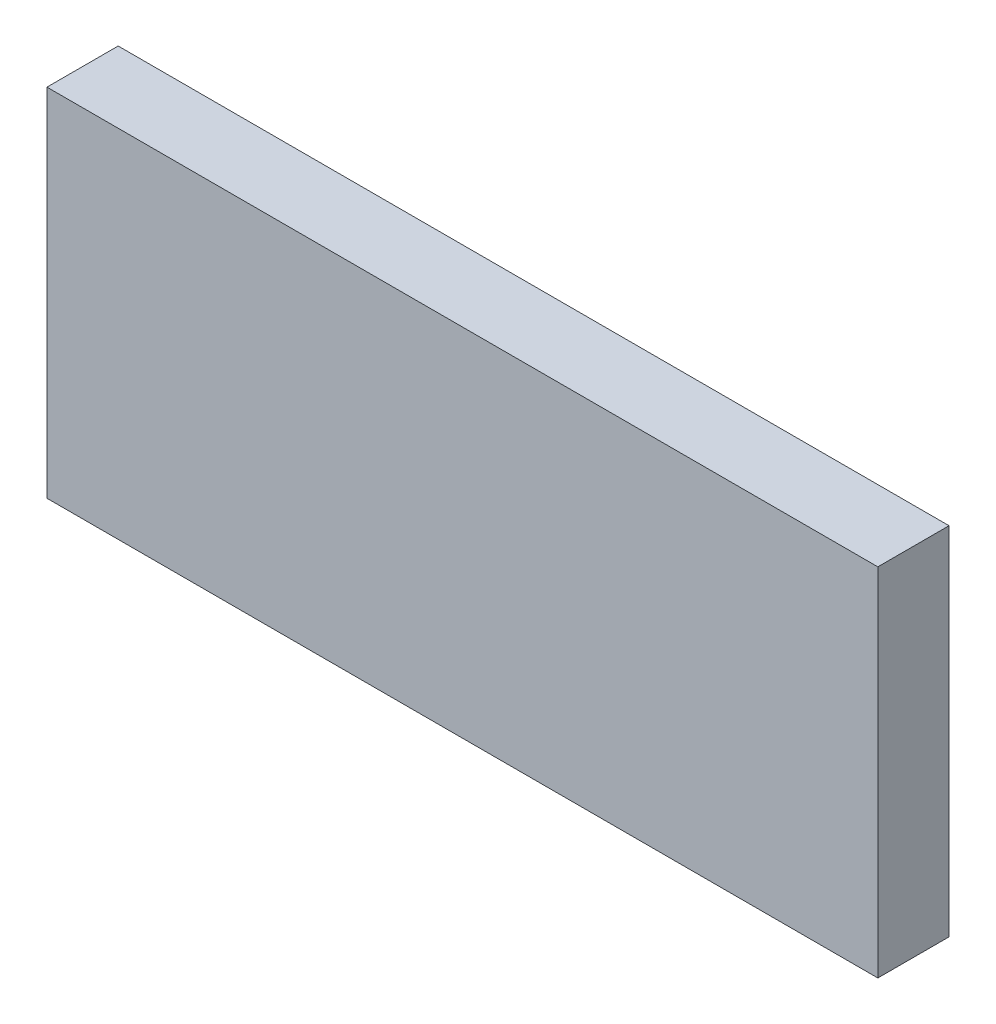
ISO-10303-21;
HEADER;
FILE_DESCRIPTION(('STEP AP214'),'2;1');
FILE_NAME('part.step','',(''),(''),'','','');
FILE_SCHEMA(('AUTOMOTIVE_DESIGN { 1 0 10303 214 1 1 1 1 }'));
ENDSEC;
DATA;
#1=APPLICATION_CONTEXT('core data for automotive mechanical design processes');
#2=APPLICATION_PROTOCOL_DEFINITION('international standard','automotive_design',2000,#1);
#3=PRODUCT_CONTEXT('',#1,'mechanical');
#4=PRODUCT('Part','Part','',(#3));
#5=PRODUCT_RELATED_PRODUCT_CATEGORY('part','',(#4));
#6=PRODUCT_DEFINITION_FORMATION('','',#4);
#7=PRODUCT_DEFINITION_CONTEXT('part definition',#1,'design');
#8=PRODUCT_DEFINITION('design','',#6,#7);
#9=PRODUCT_DEFINITION_SHAPE('','',#8);
#10=(LENGTH_UNIT() NAMED_UNIT(*) SI_UNIT(.MILLI.,.METRE.));
#11=(NAMED_UNIT(*) PLANE_ANGLE_UNIT() SI_UNIT($,.RADIAN.));
#12=(NAMED_UNIT(*) SI_UNIT($,.STERADIAN.) SOLID_ANGLE_UNIT());
#13=UNCERTAINTY_MEASURE_WITH_UNIT(LENGTH_MEASURE(1.E-05),#10,'distance_accuracy_value','');
#14=(GEOMETRIC_REPRESENTATION_CONTEXT(3) GLOBAL_UNCERTAINTY_ASSIGNED_CONTEXT((#13)) GLOBAL_UNIT_ASSIGNED_CONTEXT((#10,
#11,#12)) REPRESENTATION_CONTEXT('',''));
#15=CARTESIAN_POINT('',(0.,0.,0.));
#16=DIRECTION('',(0.,0.,1.));
#17=DIRECTION('',(1.,0.,0.));
#18=AXIS2_PLACEMENT_3D('',#15,#16,#17);
#19=CARTESIAN_POINT('',(0.,0.,6.));
#20=DIRECTION('',(1.,0.,0.));
#21=DIRECTION('',(0.,0.,-1.));
#22=AXIS2_PLACEMENT_3D('',#19,#20,#21);
#23=PLANE('',#22);
#24=DIRECTION('',(0.,-1.,0.));
#25=VECTOR('',#24,1.);
#26=CARTESIAN_POINT('',(0.,0.,0.));
#27=LINE('',#26,#25);
#28=CARTESIAN_POINT('',(0.,30.,0.));
#29=VERTEX_POINT('',#28);
#30=CARTESIAN_POINT('',(0.,0.,0.));
#31=VERTEX_POINT('',#30);
#32=EDGE_CURVE('E98',#29,#31,#27,.T.);
#33=ORIENTED_EDGE('',*,*,#32,.T.);
#34=DIRECTION('',(0.,0.,-1.));
#35=VECTOR('',#34,1.);
#36=CARTESIAN_POINT('',(0.,0.,6.));
#37=LINE('',#36,#35);
#38=CARTESIAN_POINT('',(0.,0.,6.));
#39=VERTEX_POINT('',#38);
#40=EDGE_CURVE('E11',#39,#31,#37,.T.);
#41=ORIENTED_EDGE('',*,*,#40,.F.);
#42=DIRECTION('',(0.,-1.,0.));
#43=VECTOR('',#42,1.);
#44=CARTESIAN_POINT('',(0.,0.,6.));
#45=LINE('',#44,#43);
#46=CARTESIAN_POINT('',(0.,30.,6.));
#47=VERTEX_POINT('',#46);
#48=EDGE_CURVE('E86',#47,#39,#45,.T.);
#49=ORIENTED_EDGE('',*,*,#48,.F.);
#50=DIRECTION('',(0.,0.,-1.));
#51=VECTOR('',#50,1.);
#52=CARTESIAN_POINT('',(0.,30.,6.));
#53=LINE('',#52,#51);
#54=EDGE_CURVE('E94',#47,#29,#53,.T.);
#55=ORIENTED_EDGE('',*,*,#54,.T.);
#56=EDGE_LOOP('',(#33,#41,#49,#55));
#57=FACE_BOUND('',#56,.T.);
#58=ADVANCED_FACE('F35',(#57),#23,.F.);
#59=CARTESIAN_POINT('',(0.,0.,6.));
#60=DIRECTION('',(0.,1.,0.));
#61=DIRECTION('',(0.,0.,1.));
#62=AXIS2_PLACEMENT_3D('',#59,#60,#61);
#63=PLANE('',#62);
#64=DIRECTION('',(1.,0.,0.));
#65=VECTOR('',#64,1.);
#66=CARTESIAN_POINT('',(0.,0.,0.));
#67=LINE('',#66,#65);
#68=CARTESIAN_POINT('',(70.,0.,0.));
#69=VERTEX_POINT('',#68);
#70=EDGE_CURVE('E90',#31,#69,#67,.T.);
#71=ORIENTED_EDGE('',*,*,#70,.T.);
#72=DIRECTION('',(0.,0.,-1.));
#73=VECTOR('',#72,1.);
#74=CARTESIAN_POINT('',(70.,0.,6.));
#75=LINE('',#74,#73);
#76=CARTESIAN_POINT('',(70.,0.,6.));
#77=VERTEX_POINT('',#76);
#78=EDGE_CURVE('E43',#77,#69,#75,.T.);
#79=ORIENTED_EDGE('',*,*,#78,.F.);
#80=DIRECTION('',(1.,0.,0.));
#81=VECTOR('',#80,1.);
#82=CARTESIAN_POINT('',(0.,0.,6.));
#83=LINE('',#82,#81);
#84=EDGE_CURVE('E81',#39,#77,#83,.T.);
#85=ORIENTED_EDGE('',*,*,#84,.F.);
#86=ORIENTED_EDGE('',*,*,#40,.T.);
#87=EDGE_LOOP('',(#71,#79,#85,#86));
#88=FACE_BOUND('',#87,.T.);
#89=ADVANCED_FACE('F89',(#88),#63,.F.);
#90=CARTESIAN_POINT('',(70.,0.,6.));
#91=DIRECTION('',(-1.,0.,0.));
#92=DIRECTION('',(0.,0.,1.));
#93=AXIS2_PLACEMENT_3D('',#90,#91,#92);
#94=PLANE('',#93);
#95=DIRECTION('',(0.,1.,0.));
#96=VECTOR('',#95,1.);
#97=CARTESIAN_POINT('',(70.,0.,0.));
#98=LINE('',#97,#96);
#99=CARTESIAN_POINT('',(70.,30.,0.));
#100=VERTEX_POINT('',#99);
#101=EDGE_CURVE('E68',#69,#100,#98,.T.);
#102=ORIENTED_EDGE('',*,*,#101,.T.);
#103=DIRECTION('',(0.,0.,-1.));
#104=VECTOR('',#103,1.);
#105=CARTESIAN_POINT('',(70.,30.,6.));
#106=LINE('',#105,#104);
#107=CARTESIAN_POINT('',(70.,30.,6.));
#108=VERTEX_POINT('',#107);
#109=EDGE_CURVE('E91',#108,#100,#106,.T.);
#110=ORIENTED_EDGE('',*,*,#109,.F.);
#111=DIRECTION('',(0.,1.,0.));
#112=VECTOR('',#111,1.);
#113=CARTESIAN_POINT('',(70.,0.,6.));
#114=LINE('',#113,#112);
#115=EDGE_CURVE('E84',#77,#108,#114,.T.);
#116=ORIENTED_EDGE('',*,*,#115,.F.);
#117=ORIENTED_EDGE('',*,*,#78,.T.);
#118=EDGE_LOOP('',(#102,#110,#116,#117));
#119=FACE_BOUND('',#118,.T.);
#120=ADVANCED_FACE('F92',(#119),#94,.F.);
#121=CARTESIAN_POINT('',(0.,30.,6.));
#122=DIRECTION('',(0.,-1.,0.));
#123=DIRECTION('',(0.,0.,-1.));
#124=AXIS2_PLACEMENT_3D('',#121,#122,#123);
#125=PLANE('',#124);
#126=DIRECTION('',(-1.,0.,0.));
#127=VECTOR('',#126,1.);
#128=CARTESIAN_POINT('',(0.,30.,0.));
#129=LINE('',#128,#127);
#130=EDGE_CURVE('E74',#100,#29,#129,.T.);
#131=ORIENTED_EDGE('',*,*,#130,.T.);
#132=ORIENTED_EDGE('',*,*,#54,.F.);
#133=DIRECTION('',(-1.,0.,0.));
#134=VECTOR('',#133,1.);
#135=CARTESIAN_POINT('',(0.,30.,6.));
#136=LINE('',#135,#134);
#137=EDGE_CURVE('E51',#108,#47,#136,.T.);
#138=ORIENTED_EDGE('',*,*,#137,.F.);
#139=ORIENTED_EDGE('',*,*,#109,.T.);
#140=EDGE_LOOP('',(#131,#132,#138,#139));
#141=FACE_BOUND('',#140,.T.);
#142=ADVANCED_FACE('F105',(#141),#125,.F.);
#143=CARTESIAN_POINT('',(0.,0.,6.));
#144=DIRECTION('',(0.,0.,-1.));
#145=DIRECTION('',(-1.,0.,0.));
#146=AXIS2_PLACEMENT_3D('',#143,#144,#145);
#147=PLANE('',#146);
#148=ORIENTED_EDGE('',*,*,#48,.T.);
#149=ORIENTED_EDGE('',*,*,#84,.T.);
#150=ORIENTED_EDGE('',*,*,#115,.T.);
#151=ORIENTED_EDGE('',*,*,#137,.T.);
#152=EDGE_LOOP('',(#148,#149,#150,#151));
#153=FACE_BOUND('',#152,.T.);
#154=ADVANCED_FACE('F82',(#153),#147,.F.);
#155=CARTESIAN_POINT('',(0.,0.,0.));
#156=DIRECTION('',(0.,0.,-1.));
#157=DIRECTION('',(-1.,0.,0.));
#158=AXIS2_PLACEMENT_3D('',#155,#156,#157);
#159=PLANE('',#158);
#160=ORIENTED_EDGE('',*,*,#32,.F.);
#161=ORIENTED_EDGE('',*,*,#130,.F.);
#162=ORIENTED_EDGE('',*,*,#101,.F.);
#163=ORIENTED_EDGE('',*,*,#70,.F.);
#164=EDGE_LOOP('',(#160,#161,#162,#163));
#165=FACE_BOUND('',#164,.T.);
#166=ADVANCED_FACE('F108',(#165),#159,.T.);
#167=CLOSED_SHELL('',(#58,#89,#120,#142,#154,#166));
#168=MANIFOLD_SOLID_BREP('B2',#167);
#169=ADVANCED_BREP_SHAPE_REPRESENTATION('',(#18,#168),#14);
#170=SHAPE_DEFINITION_REPRESENTATION(#9,#169);
ENDSEC;
END-ISO-10303-21;
